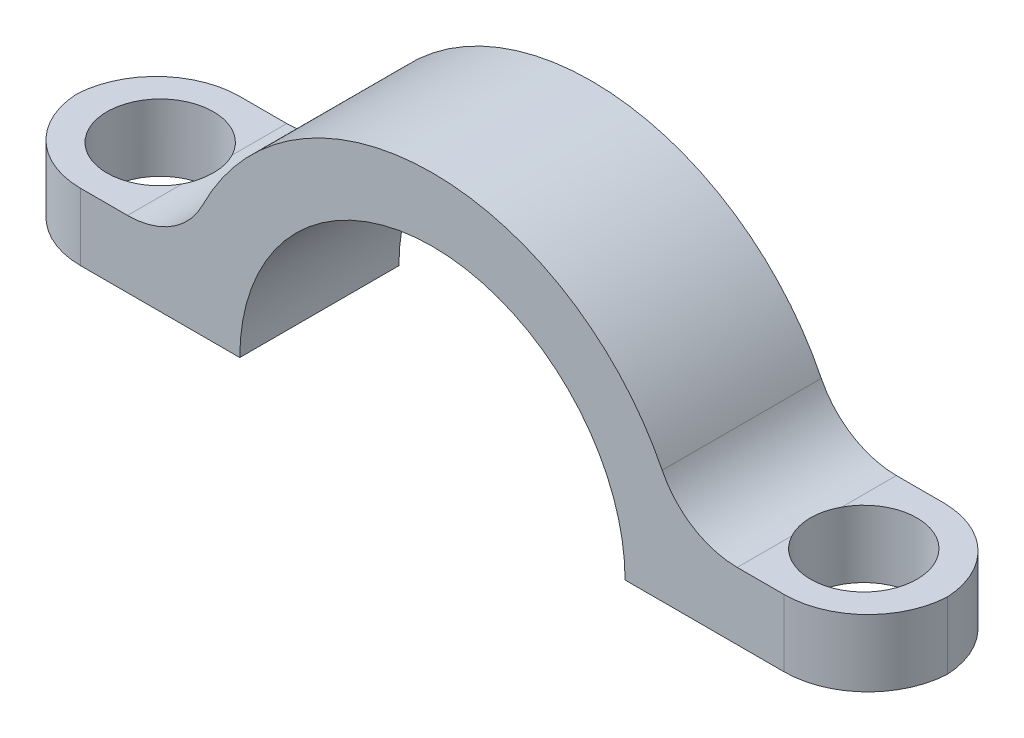
ISO-10303-21;
HEADER;
FILE_DESCRIPTION(('STEP AP214'),'2;1');
FILE_NAME('part.step','',(''),(''),'','','');
FILE_SCHEMA(('AUTOMOTIVE_DESIGN { 1 0 10303 214 1 1 1 1 }'));
ENDSEC;
DATA;
#1=APPLICATION_CONTEXT('core data for automotive mechanical design processes');
#2=APPLICATION_PROTOCOL_DEFINITION('international standard','automotive_design',2000,#1);
#3=PRODUCT_CONTEXT('',#1,'mechanical');
#4=PRODUCT('Part','Part','',(#3));
#5=PRODUCT_RELATED_PRODUCT_CATEGORY('part','',(#4));
#6=PRODUCT_DEFINITION_FORMATION('','',#4);
#7=PRODUCT_DEFINITION_CONTEXT('part definition',#1,'design');
#8=PRODUCT_DEFINITION('design','',#6,#7);
#9=PRODUCT_DEFINITION_SHAPE('','',#8);
#10=(LENGTH_UNIT() NAMED_UNIT(*) SI_UNIT(.MILLI.,.METRE.));
#11=(NAMED_UNIT(*) PLANE_ANGLE_UNIT() SI_UNIT($,.RADIAN.));
#12=(NAMED_UNIT(*) SI_UNIT($,.STERADIAN.) SOLID_ANGLE_UNIT());
#13=UNCERTAINTY_MEASURE_WITH_UNIT(LENGTH_MEASURE(1.E-05),#10,'distance_accuracy_value','');
#14=(GEOMETRIC_REPRESENTATION_CONTEXT(3) GLOBAL_UNCERTAINTY_ASSIGNED_CONTEXT((#13)) GLOBAL_UNIT_ASSIGNED_CONTEXT((#10,
#11,#12)) REPRESENTATION_CONTEXT('',''));
#15=CARTESIAN_POINT('',(0.,0.,0.));
#16=DIRECTION('',(0.,0.,1.));
#17=DIRECTION('',(1.,0.,0.));
#18=AXIS2_PLACEMENT_3D('',#15,#16,#17);
#19=CARTESIAN_POINT('',(0.,0.,9.5));
#20=DIRECTION('',(0.,0.,-1.));
#21=DIRECTION('',(-1.,0.,0.));
#22=AXIS2_PLACEMENT_3D('',#19,#20,#21);
#23=CYLINDRICAL_SURFACE('',#22,11.5);
#24=CARTESIAN_POINT('',(0.,0.,0.));
#25=DIRECTION('',(0.,0.,-1.));
#26=DIRECTION('',(1.,0.,0.));
#27=AXIS2_PLACEMENT_3D('',#24,#25,#26);
#28=CIRCLE('',#27,11.5);
#29=CARTESIAN_POINT('',(-11.5,0.,0.));
#30=VERTEX_POINT('',#29);
#31=CARTESIAN_POINT('',(11.5,0.,0.));
#32=VERTEX_POINT('',#31);
#33=EDGE_CURVE('E268',#30,#32,#28,.T.);
#34=ORIENTED_EDGE('',*,*,#33,.T.);
#35=DIRECTION('',(0.,0.,-1.));
#36=VECTOR('',#35,1.);
#37=CARTESIAN_POINT('',(11.5,0.,9.5));
#38=LINE('',#37,#36);
#39=CARTESIAN_POINT('',(11.5,0.,9.5));
#40=VERTEX_POINT('',#39);
#41=EDGE_CURVE('E248',#40,#32,#38,.T.);
#42=ORIENTED_EDGE('',*,*,#41,.F.);
#43=CARTESIAN_POINT('',(0.,0.,9.5));
#44=DIRECTION('',(0.,0.,-1.));
#45=DIRECTION('',(1.,0.,0.));
#46=AXIS2_PLACEMENT_3D('',#43,#44,#45);
#47=CIRCLE('',#46,11.5);
#48=CARTESIAN_POINT('',(-11.5,0.,9.5));
#49=VERTEX_POINT('',#48);
#50=EDGE_CURVE('E259',#49,#40,#47,.T.);
#51=ORIENTED_EDGE('',*,*,#50,.F.);
#52=DIRECTION('',(0.,0.,-1.));
#53=VECTOR('',#52,1.);
#54=CARTESIAN_POINT('',(-11.5,0.,9.5));
#55=LINE('',#54,#53);
#56=EDGE_CURVE('E253',#49,#30,#55,.T.);
#57=ORIENTED_EDGE('',*,*,#56,.T.);
#58=EDGE_LOOP('',(#34,#42,#51,#57));
#59=FACE_BOUND('',#58,.T.);
#60=ADVANCED_FACE('F37',(#59),#23,.F.);
#61=CARTESIAN_POINT('',(11.5,0.,9.5));
#62=DIRECTION('',(0.,1.,0.));
#63=DIRECTION('',(-1.,0.,0.));
#64=AXIS2_PLACEMENT_3D('',#61,#62,#63);
#65=PLANE('',#64);
#66=CARTESIAN_POINT('',(21.,0.,4.75));
#67=DIRECTION('',(0.,1.,0.));
#68=DIRECTION('',(0.,0.,1.));
#69=AXIS2_PLACEMENT_3D('',#66,#67,#68);
#70=CIRCLE('',#69,3.175);
#71=CARTESIAN_POINT('',(21.,0.,7.925));
#72=VERTEX_POINT('',#71);
#73=EDGE_CURVE('E285',#72,#72,#70,.T.);
#74=ORIENTED_EDGE('',*,*,#73,.T.);
#75=EDGE_LOOP('',(#74));
#76=FACE_BOUND('',#75,.T.);
#77=DIRECTION('',(1.,0.,0.));
#78=VECTOR('',#77,1.);
#79=CARTESIAN_POINT('',(11.5,0.,0.));
#80=LINE('',#79,#78);
#81=CARTESIAN_POINT('',(21.,0.,0.));
#82=VERTEX_POINT('',#81);
#83=EDGE_CURVE('E266',#32,#82,#80,.T.);
#84=ORIENTED_EDGE('',*,*,#83,.T.);
#85=CARTESIAN_POINT('',(21.,0.,5.));
#86=DIRECTION('',(0.,1.,0.));
#87=DIRECTION('',(-1.,0.,0.));
#88=AXIS2_PLACEMENT_3D('',#85,#86,#87);
#89=CIRCLE('',#88,5.);
#90=CARTESIAN_POINT('',(25.9937460888595,0.,4.75));
#91=VERTEX_POINT('',#90);
#92=EDGE_CURVE('E54',#82,#91,#89,.F.);
#93=ORIENTED_EDGE('',*,*,#92,.T.);
#94=CARTESIAN_POINT('',(21.,0.,4.5));
#95=DIRECTION('',(0.,1.,0.));
#96=DIRECTION('',(-1.,0.,0.));
#97=AXIS2_PLACEMENT_3D('',#94,#95,#96);
#98=CIRCLE('',#97,5.);
#99=CARTESIAN_POINT('',(21.,0.,9.5));
#100=VERTEX_POINT('',#99);
#101=EDGE_CURVE('E58',#91,#100,#98,.F.);
#102=ORIENTED_EDGE('',*,*,#101,.T.);
#103=DIRECTION('',(1.,0.,0.));
#104=VECTOR('',#103,1.);
#105=CARTESIAN_POINT('',(11.5,0.,9.5));
#106=LINE('',#105,#104);
#107=EDGE_CURVE('E280',#40,#100,#106,.T.);
#108=ORIENTED_EDGE('',*,*,#107,.F.);
#109=ORIENTED_EDGE('',*,*,#41,.T.);
#110=EDGE_LOOP('',(#84,#93,#102,#108,#109));
#111=FACE_BOUND('',#110,.T.);
#112=ADVANCED_FACE('F221',(#76,#111),#65,.F.);
#113=CARTESIAN_POINT('',(26.,4.,9.5));
#114=DIRECTION('',(0.,-1.,0.));
#115=DIRECTION('',(0.,0.,-1.));
#116=AXIS2_PLACEMENT_3D('',#113,#114,#115);
#117=PLANE('',#116);
#118=CARTESIAN_POINT('',(21.,4.,4.5));
#119=DIRECTION('',(0.,-1.,0.));
#120=DIRECTION('',(0.,0.,-1.));
#121=AXIS2_PLACEMENT_3D('',#118,#119,#120);
#122=CIRCLE('',#121,5.);
#123=CARTESIAN_POINT('',(21.,4.,9.5));
#124=VERTEX_POINT('',#123);
#125=CARTESIAN_POINT('',(25.9937460888595,4.,4.75));
#126=VERTEX_POINT('',#125);
#127=EDGE_CURVE('E319',#124,#126,#122,.F.);
#128=ORIENTED_EDGE('',*,*,#127,.T.);
#129=CARTESIAN_POINT('',(21.,4.,5.));
#130=DIRECTION('',(0.,-1.,0.));
#131=DIRECTION('',(0.,0.,-1.));
#132=AXIS2_PLACEMENT_3D('',#129,#130,#131);
#133=CIRCLE('',#132,5.);
#134=CARTESIAN_POINT('',(21.,4.,0.));
#135=VERTEX_POINT('',#134);
#136=EDGE_CURVE('E321',#126,#135,#133,.F.);
#137=ORIENTED_EDGE('',*,*,#136,.T.);
#138=DIRECTION('',(-1.,0.,0.));
#139=VECTOR('',#138,1.);
#140=CARTESIAN_POINT('',(26.,4.,0.));
#141=LINE('',#140,#139);
#142=CARTESIAN_POINT('',(18.1958786542448,4.,0.));
#143=VERTEX_POINT('',#142);
#144=EDGE_CURVE('E264',#135,#143,#141,.T.);
#145=ORIENTED_EDGE('',*,*,#144,.T.);
#146=DIRECTION('',(0.,0.,1.));
#147=VECTOR('',#146,1.);
#148=CARTESIAN_POINT('',(18.1958786542448,4.,9.5));
#149=LINE('',#148,#147);
#150=CARTESIAN_POINT('',(18.1958786542448,4.,3.26086317677662));
#151=VERTEX_POINT('',#150);
#152=EDGE_CURVE('E161',#143,#151,#149,.T.);
#153=ORIENTED_EDGE('',*,*,#152,.T.);
#154=CARTESIAN_POINT('',(21.,4.,4.75));
#155=DIRECTION('',(0.,-1.,0.));
#156=DIRECTION('',(0.,0.,-1.));
#157=AXIS2_PLACEMENT_3D('',#154,#155,#156);
#158=CIRCLE('',#157,3.175);
#159=CARTESIAN_POINT('',(18.1958786542448,4.,6.23913682322338));
#160=VERTEX_POINT('',#159);
#161=EDGE_CURVE('E154',#151,#160,#158,.T.);
#162=ORIENTED_EDGE('',*,*,#161,.T.);
#163=CARTESIAN_POINT('',(18.1958786542448,4.,9.5));
#164=VERTEX_POINT('',#163);
#165=EDGE_CURVE('E165',#160,#164,#149,.T.);
#166=ORIENTED_EDGE('',*,*,#165,.T.);
#167=DIRECTION('',(-1.,0.,0.));
#168=VECTOR('',#167,1.);
#169=CARTESIAN_POINT('',(26.,4.,9.5));
#170=LINE('',#169,#168);
#171=EDGE_CURVE('E278',#124,#164,#170,.T.);
#172=ORIENTED_EDGE('',*,*,#171,.F.);
#173=EDGE_LOOP('',(#128,#137,#145,#153,#162,#166,#172));
#174=FACE_BOUND('',#173,.T.);
#175=ADVANCED_FACE('F217',(#174),#117,.F.);
#176=CARTESIAN_POINT('',(0.,0.,9.5));
#177=DIRECTION('',(0.,0.,-1.));
#178=DIRECTION('',(-1.,0.,0.));
#179=AXIS2_PLACEMENT_3D('',#176,#177,#178);
#180=CYLINDRICAL_SURFACE('',#179,15.3);
#181=CARTESIAN_POINT('',(0.,0.,9.5));
#182=DIRECTION('',(0.,0.,1.));
#183=DIRECTION('',(1.,0.,0.));
#184=AXIS2_PLACEMENT_3D('',#181,#182,#183);
#185=CIRCLE('',#184,15.3);
#186=CARTESIAN_POINT('',(13.714135143347,6.78325123152709,9.5));
#187=VERTEX_POINT('',#186);
#188=CARTESIAN_POINT('',(-13.714135143347,6.78325123152709,9.5));
#189=VERTEX_POINT('',#188);
#190=EDGE_CURVE('E275',#187,#189,#185,.T.);
#191=ORIENTED_EDGE('',*,*,#190,.F.);
#192=DIRECTION('',(0.,0.,-1.));
#193=VECTOR('',#192,1.);
#194=CARTESIAN_POINT('',(13.714135143347,6.78325123152709,9.5));
#195=LINE('',#194,#193);
#196=CARTESIAN_POINT('',(13.714135143347,6.78325123152709,0.));
#197=VERTEX_POINT('',#196);
#198=EDGE_CURVE('E242',#187,#197,#195,.T.);
#199=ORIENTED_EDGE('',*,*,#198,.T.);
#200=CARTESIAN_POINT('',(0.,0.,0.));
#201=DIRECTION('',(0.,0.,1.));
#202=DIRECTION('',(1.,0.,0.));
#203=AXIS2_PLACEMENT_3D('',#200,#201,#202);
#204=CIRCLE('',#203,15.3);
#205=CARTESIAN_POINT('',(-13.714135143347,6.78325123152709,0.));
#206=VERTEX_POINT('',#205);
#207=EDGE_CURVE('E262',#197,#206,#204,.T.);
#208=ORIENTED_EDGE('',*,*,#207,.T.);
#209=DIRECTION('',(0.,0.,-1.));
#210=VECTOR('',#209,1.);
#211=CARTESIAN_POINT('',(-13.714135143347,6.78325123152709,9.5));
#212=LINE('',#211,#210);
#213=EDGE_CURVE('E244',#206,#189,#212,.F.);
#214=ORIENTED_EDGE('',*,*,#213,.T.);
#215=EDGE_LOOP('',(#191,#199,#208,#214));
#216=FACE_BOUND('',#215,.T.);
#217=ADVANCED_FACE('F214',(#216),#180,.T.);
#218=CARTESIAN_POINT('',(-26.,4.,9.5));
#219=DIRECTION('',(0.,-1.,0.));
#220=DIRECTION('',(0.,0.,-1.));
#221=AXIS2_PLACEMENT_3D('',#218,#219,#220);
#222=PLANE('',#221);
#223=DIRECTION('',(-1.,0.,0.));
#224=VECTOR('',#223,1.);
#225=CARTESIAN_POINT('',(-26.,4.,0.));
#226=LINE('',#225,#224);
#227=CARTESIAN_POINT('',(-18.1958786542448,4.,0.));
#228=VERTEX_POINT('',#227);
#229=CARTESIAN_POINT('',(-21.,4.,0.));
#230=VERTEX_POINT('',#229);
#231=EDGE_CURVE('E260',#228,#230,#226,.T.);
#232=ORIENTED_EDGE('',*,*,#231,.T.);
#233=CARTESIAN_POINT('',(-21.,4.,5.));
#234=DIRECTION('',(0.,-1.,0.));
#235=DIRECTION('',(0.,0.,-1.));
#236=AXIS2_PLACEMENT_3D('',#233,#234,#235);
#237=CIRCLE('',#236,5.);
#238=CARTESIAN_POINT('',(-25.9937460888595,4.,4.75));
#239=VERTEX_POINT('',#238);
#240=EDGE_CURVE('E317',#230,#239,#237,.F.);
#241=ORIENTED_EDGE('',*,*,#240,.T.);
#242=CARTESIAN_POINT('',(-21.,4.,4.5));
#243=DIRECTION('',(0.,-1.,0.));
#244=DIRECTION('',(0.,0.,-1.));
#245=AXIS2_PLACEMENT_3D('',#242,#243,#244);
#246=CIRCLE('',#245,5.);
#247=CARTESIAN_POINT('',(-21.,4.,9.5));
#248=VERTEX_POINT('',#247);
#249=EDGE_CURVE('E304',#239,#248,#246,.F.);
#250=ORIENTED_EDGE('',*,*,#249,.T.);
#251=DIRECTION('',(-1.,0.,0.));
#252=VECTOR('',#251,1.);
#253=CARTESIAN_POINT('',(-26.,4.,9.5));
#254=LINE('',#253,#252);
#255=CARTESIAN_POINT('',(-18.1958786542448,4.,9.5));
#256=VERTEX_POINT('',#255);
#257=EDGE_CURVE('E272',#256,#248,#254,.T.);
#258=ORIENTED_EDGE('',*,*,#257,.F.);
#259=DIRECTION('',(0.,0.,1.));
#260=VECTOR('',#259,1.);
#261=CARTESIAN_POINT('',(-18.1958786542448,4.,0.));
#262=LINE('',#261,#260);
#263=CARTESIAN_POINT('',(-18.1958786542448,4.,6.23913682322339));
#264=VERTEX_POINT('',#263);
#265=EDGE_CURVE('E153',#256,#264,#262,.F.);
#266=ORIENTED_EDGE('',*,*,#265,.T.);
#267=CARTESIAN_POINT('',(-21.,4.,4.75));
#268=DIRECTION('',(0.,-1.,0.));
#269=DIRECTION('',(0.,0.,-1.));
#270=AXIS2_PLACEMENT_3D('',#267,#268,#269);
#271=CIRCLE('',#270,3.175);
#272=CARTESIAN_POINT('',(-18.1958786542448,4.,3.26086317677661));
#273=VERTEX_POINT('',#272);
#274=EDGE_CURVE('E139',#264,#273,#271,.T.);
#275=ORIENTED_EDGE('',*,*,#274,.T.);
#276=EDGE_CURVE('E150',#273,#228,#262,.F.);
#277=ORIENTED_EDGE('',*,*,#276,.T.);
#278=EDGE_LOOP('',(#232,#241,#250,#258,#266,#275,#277));
#279=FACE_BOUND('',#278,.T.);
#280=ADVANCED_FACE('F149',(#279),#222,.F.);
#281=CARTESIAN_POINT('',(-11.5,0.,9.5));
#282=DIRECTION('',(0.,1.,0.));
#283=DIRECTION('',(-1.,0.,0.));
#284=AXIS2_PLACEMENT_3D('',#281,#282,#283);
#285=PLANE('',#284);
#286=CARTESIAN_POINT('',(-21.,0.,4.75));
#287=DIRECTION('',(0.,1.,0.));
#288=DIRECTION('',(0.,0.,1.));
#289=AXIS2_PLACEMENT_3D('',#286,#287,#288);
#290=CIRCLE('',#289,3.175);
#291=CARTESIAN_POINT('',(-21.,0.,7.925));
#292=VERTEX_POINT('',#291);
#293=EDGE_CURVE('E155',#292,#292,#290,.T.);
#294=ORIENTED_EDGE('',*,*,#293,.T.);
#295=EDGE_LOOP('',(#294));
#296=FACE_BOUND('',#295,.T.);
#297=CARTESIAN_POINT('',(-21.,0.,4.5));
#298=DIRECTION('',(0.,1.,0.));
#299=DIRECTION('',(-1.,0.,0.));
#300=AXIS2_PLACEMENT_3D('',#297,#298,#299);
#301=CIRCLE('',#300,5.);
#302=CARTESIAN_POINT('',(-21.,0.,9.5));
#303=VERTEX_POINT('',#302);
#304=CARTESIAN_POINT('',(-25.9937460888595,0.,4.75));
#305=VERTEX_POINT('',#304);
#306=EDGE_CURVE('E294',#303,#305,#301,.F.);
#307=ORIENTED_EDGE('',*,*,#306,.T.);
#308=CARTESIAN_POINT('',(-21.,0.,5.));
#309=DIRECTION('',(0.,1.,0.));
#310=DIRECTION('',(-1.,0.,0.));
#311=AXIS2_PLACEMENT_3D('',#308,#309,#310);
#312=CIRCLE('',#311,5.);
#313=CARTESIAN_POINT('',(-21.,0.,0.));
#314=VERTEX_POINT('',#313);
#315=EDGE_CURVE('E297',#305,#314,#312,.F.);
#316=ORIENTED_EDGE('',*,*,#315,.T.);
#317=DIRECTION('',(1.,0.,0.));
#318=VECTOR('',#317,1.);
#319=CARTESIAN_POINT('',(-11.5,0.,0.));
#320=LINE('',#319,#318);
#321=EDGE_CURVE('E257',#314,#30,#320,.T.);
#322=ORIENTED_EDGE('',*,*,#321,.T.);
#323=ORIENTED_EDGE('',*,*,#56,.F.);
#324=DIRECTION('',(1.,0.,0.));
#325=VECTOR('',#324,1.);
#326=CARTESIAN_POINT('',(-11.5,0.,9.5));
#327=LINE('',#326,#325);
#328=EDGE_CURVE('E256',#303,#49,#327,.T.);
#329=ORIENTED_EDGE('',*,*,#328,.F.);
#330=EDGE_LOOP('',(#307,#316,#322,#323,#329));
#331=FACE_BOUND('',#330,.T.);
#332=ADVANCED_FACE('F203',(#296,#331),#285,.F.);
#333=CARTESIAN_POINT('',(0.,0.,9.5));
#334=DIRECTION('',(0.,0.,1.));
#335=DIRECTION('',(1.,0.,0.));
#336=AXIS2_PLACEMENT_3D('',#333,#334,#335);
#337=PLANE('',#336);
#338=ORIENTED_EDGE('',*,*,#107,.T.);
#339=DIRECTION('',(0.,1.,0.));
#340=VECTOR('',#339,1.);
#341=CARTESIAN_POINT('',(21.,4.,9.5));
#342=LINE('',#341,#340);
#343=EDGE_CURVE('E11',#100,#124,#342,.T.);
#344=ORIENTED_EDGE('',*,*,#343,.T.);
#345=ORIENTED_EDGE('',*,*,#171,.T.);
#346=CARTESIAN_POINT('',(18.1958786542448,9.,9.5));
#347=DIRECTION('',(0.,0.,1.));
#348=DIRECTION('',(1.,0.,0.));
#349=AXIS2_PLACEMENT_3D('',#346,#347,#348);
#350=CIRCLE('',#349,5.);
#351=EDGE_CURVE('E171',#164,#187,#350,.F.);
#352=ORIENTED_EDGE('',*,*,#351,.T.);
#353=ORIENTED_EDGE('',*,*,#190,.T.);
#354=CARTESIAN_POINT('',(-18.1958786542448,9.,9.5));
#355=DIRECTION('',(0.,0.,1.));
#356=DIRECTION('',(1.,0.,0.));
#357=AXIS2_PLACEMENT_3D('',#354,#355,#356);
#358=CIRCLE('',#357,5.);
#359=EDGE_CURVE('E145',#189,#256,#358,.F.);
#360=ORIENTED_EDGE('',*,*,#359,.T.);
#361=ORIENTED_EDGE('',*,*,#257,.T.);
#362=DIRECTION('',(0.,-1.,0.));
#363=VECTOR('',#362,1.);
#364=CARTESIAN_POINT('',(-21.,0.,9.5));
#365=LINE('',#364,#363);
#366=EDGE_CURVE('E46',#248,#303,#365,.T.);
#367=ORIENTED_EDGE('',*,*,#366,.T.);
#368=ORIENTED_EDGE('',*,*,#328,.T.);
#369=ORIENTED_EDGE('',*,*,#50,.T.);
#370=EDGE_LOOP('',(#338,#344,#345,#352,#353,#360,#361,#367,#368,#369));
#371=FACE_BOUND('',#370,.T.);
#372=ADVANCED_FACE('F199',(#371),#337,.T.);
#373=CARTESIAN_POINT('',(0.,0.,0.));
#374=DIRECTION('',(0.,0.,1.));
#375=DIRECTION('',(1.,0.,0.));
#376=AXIS2_PLACEMENT_3D('',#373,#374,#375);
#377=PLANE('',#376);
#378=ORIENTED_EDGE('',*,*,#321,.F.);
#379=DIRECTION('',(0.,-1.,0.));
#380=VECTOR('',#379,1.);
#381=CARTESIAN_POINT('',(-21.,0.,0.));
#382=LINE('',#381,#380);
#383=EDGE_CURVE('E309',#314,#230,#382,.F.);
#384=ORIENTED_EDGE('',*,*,#383,.T.);
#385=ORIENTED_EDGE('',*,*,#231,.F.);
#386=CARTESIAN_POINT('',(-18.1958786542448,9.,0.));
#387=DIRECTION('',(0.,0.,1.));
#388=DIRECTION('',(1.,0.,0.));
#389=AXIS2_PLACEMENT_3D('',#386,#387,#388);
#390=CIRCLE('',#389,5.);
#391=EDGE_CURVE('E159',#228,#206,#390,.T.);
#392=ORIENTED_EDGE('',*,*,#391,.T.);
#393=ORIENTED_EDGE('',*,*,#207,.F.);
#394=CARTESIAN_POINT('',(18.1958786542448,9.,0.));
#395=DIRECTION('',(0.,0.,1.));
#396=DIRECTION('',(1.,0.,0.));
#397=AXIS2_PLACEMENT_3D('',#394,#395,#396);
#398=CIRCLE('',#397,5.);
#399=EDGE_CURVE('E163',#197,#143,#398,.T.);
#400=ORIENTED_EDGE('',*,*,#399,.T.);
#401=ORIENTED_EDGE('',*,*,#144,.F.);
#402=DIRECTION('',(0.,1.,0.));
#403=VECTOR('',#402,1.);
#404=CARTESIAN_POINT('',(21.,0.,0.));
#405=LINE('',#404,#403);
#406=EDGE_CURVE('E310',#135,#82,#405,.F.);
#407=ORIENTED_EDGE('',*,*,#406,.T.);
#408=ORIENTED_EDGE('',*,*,#83,.F.);
#409=ORIENTED_EDGE('',*,*,#33,.F.);
#410=EDGE_LOOP('',(#378,#384,#385,#392,#393,#400,#401,#407,#408,#409));
#411=FACE_BOUND('',#410,.T.);
#412=ADVANCED_FACE('F202',(#411),#377,.F.);
#413=CARTESIAN_POINT('',(18.1958786542448,9.,9.5));
#414=DIRECTION('',(0.,0.,-1.));
#415=DIRECTION('',(-1.,0.,0.));
#416=AXIS2_PLACEMENT_3D('',#413,#414,#415);
#417=CYLINDRICAL_SURFACE('',#416,5.);
#418=ORIENTED_EDGE('',*,*,#165,.F.);
#419=CARTESIAN_POINT('',(18.1958786542448,4.,6.23913682322338));
#420=CARTESIAN_POINT('',(18.1539979476198,4.00001147946186,6.16029156971243));
#421=CARTESIAN_POINT('',(18.1154614955096,4.00052666383196,6.07967865545317));
#422=CARTESIAN_POINT('',(18.0453127127969,4.00214135114437,5.91550513643708));
#423=CARTESIAN_POINT('',(18.013699965699,4.00324081892547,5.83194470933921));
#424=CARTESIAN_POINT('',(17.9576657181,4.00559954399005,5.66256482781802));
#425=CARTESIAN_POINT('',(17.9332348811282,4.00685859074466,5.57674846572808));
#426=CARTESIAN_POINT('',(17.8916780247956,4.00921996392662,5.40338645388867));
#427=CARTESIAN_POINT('',(17.8745518827946,4.01032229298493,5.31584083319795));
#428=CARTESIAN_POINT('',(17.834318126288,4.01300802787872,5.05138558363555));
#429=CARTESIAN_POINT('',(17.8223517246599,4.01397039217124,4.87264708609901));
#430=CARTESIAN_POINT('',(17.8286292561209,4.01350483051492,4.5157397572401));
#431=CARTESIAN_POINT('',(17.8468657306821,4.01207749469585,4.33757079615777));
#432=CARTESIAN_POINT('',(17.8946377484826,4.00906484455122,4.08384739875444));
#433=CARTESIAN_POINT('',(17.9123874026605,4.00800121226595,4.0059148305011));
#434=CARTESIAN_POINT('',(17.9537123580366,4.00582413766147,3.8515968573053));
#435=CARTESIAN_POINT('',(17.9772871796282,4.00471069944913,3.77521132554981));
#436=CARTESIAN_POINT('',(18.0301481422886,4.00267719894945,3.62439143057265));
#437=CARTESIAN_POINT('',(18.0594378249503,4.00175725731352,3.54995830990824));
#438=CARTESIAN_POINT('',(18.1235509843115,4.00042219450671,3.40349877681184));
#439=CARTESIAN_POINT('',(18.1583751958776,4.00000714043748,3.33147268552085));
#440=CARTESIAN_POINT('',(18.1958786542448,4.,3.26086317677662));
#441=B_SPLINE_CURVE_WITH_KNOTS('',3,(#419,#420,#421,#422,#423,#424,#425,#426,#427,#428,#429,
#430,#431,#432,#433,#434,#435,#436,#437,#438,#439,#440),.UNSPECIFIED.,.F.,.F.,(4,2,2,2,2,2,2,2,
2,2,4),(0.,0.267741417285312,0.535466724156736,0.802842433651225,1.07021365393546,
1.6049234011075,2.13950112267405,2.3791267210745,2.61873259682987,2.85848743461483,
3.09827413332856),.UNSPECIFIED.);
#442=EDGE_CURVE('E144',#160,#151,#441,.T.);
#443=ORIENTED_EDGE('',*,*,#442,.T.);
#444=ORIENTED_EDGE('',*,*,#152,.F.);
#445=ORIENTED_EDGE('',*,*,#399,.F.);
#446=ORIENTED_EDGE('',*,*,#198,.F.);
#447=ORIENTED_EDGE('',*,*,#351,.F.);
#448=EDGE_LOOP('',(#418,#443,#444,#445,#446,#447));
#449=FACE_BOUND('',#448,.T.);
#450=ADVANCED_FACE('F207',(#449),#417,.F.);
#451=CARTESIAN_POINT('',(-18.1958786542448,9.,9.5));
#452=DIRECTION('',(0.,0.,-1.));
#453=DIRECTION('',(-1.,0.,0.));
#454=AXIS2_PLACEMENT_3D('',#451,#452,#453);
#455=CYLINDRICAL_SURFACE('',#454,5.);
#456=ORIENTED_EDGE('',*,*,#276,.F.);
#457=CARTESIAN_POINT('',(-18.1958786542448,4.,3.26086317677661));
#458=CARTESIAN_POINT('',(-18.1539979476198,4.00001147946186,3.33970843028756));
#459=CARTESIAN_POINT('',(-18.1154614955096,4.00052666383196,3.42032134454682));
#460=CARTESIAN_POINT('',(-18.0453127127969,4.00214135114437,3.5844948635629));
#461=CARTESIAN_POINT('',(-18.013699965699,4.00324081892547,3.66805529066078));
#462=CARTESIAN_POINT('',(-17.9576657181,4.00559954399005,3.83743517218196));
#463=CARTESIAN_POINT('',(-17.9332348811282,4.00685859074466,3.92325153427191));
#464=CARTESIAN_POINT('',(-17.8916780247956,4.00921996392662,4.09661354611132));
#465=CARTESIAN_POINT('',(-17.8745518827946,4.01032229298493,4.18415916680204));
#466=CARTESIAN_POINT('',(-17.834318126288,4.01300802787872,4.44861441636444));
#467=CARTESIAN_POINT('',(-17.8223517246599,4.01397039217124,4.62735291390097));
#468=CARTESIAN_POINT('',(-17.8286292561209,4.01350483051492,4.98426024275989));
#469=CARTESIAN_POINT('',(-17.8468657306821,4.01207749469585,5.16242920384222));
#470=CARTESIAN_POINT('',(-17.8946377484826,4.00906484455122,5.41615260124555));
#471=CARTESIAN_POINT('',(-17.9123874026605,4.00800121226596,5.49408516949889));
#472=CARTESIAN_POINT('',(-17.9537123580366,4.00582413766147,5.6484031426947));
#473=CARTESIAN_POINT('',(-17.9772871796282,4.00471069944913,5.72478867445019));
#474=CARTESIAN_POINT('',(-18.0301481422886,4.00267719894945,5.87560856942735));
#475=CARTESIAN_POINT('',(-18.0594378249503,4.00175725731352,5.95004169009176));
#476=CARTESIAN_POINT('',(-18.1235509843115,4.00042219450671,6.09650122318816));
#477=CARTESIAN_POINT('',(-18.1583751958776,4.00000714043748,6.16852731447916));
#478=CARTESIAN_POINT('',(-18.1958786542448,4.,6.23913682322339));
#479=B_SPLINE_CURVE_WITH_KNOTS('',3,(#457,#458,#459,#460,#461,#462,#463,#464,#465,#466,#467,
#468,#469,#470,#471,#472,#473,#474,#475,#476,#477,#478),.UNSPECIFIED.,.F.,.F.,(4,2,2,2,2,2,2,2,
2,2,4),(0.,0.267741417285313,0.535466724156739,0.802842433651227,1.07021365393546,
1.6049234011075,2.13950112267405,2.37912672107451,2.61873259682988,2.85848743461485,
3.09827413332859),.UNSPECIFIED.);
#480=EDGE_CURVE('E136',#273,#264,#479,.T.);
#481=ORIENTED_EDGE('',*,*,#480,.T.);
#482=ORIENTED_EDGE('',*,*,#265,.F.);
#483=ORIENTED_EDGE('',*,*,#359,.F.);
#484=ORIENTED_EDGE('',*,*,#213,.F.);
#485=ORIENTED_EDGE('',*,*,#391,.F.);
#486=EDGE_LOOP('',(#456,#481,#482,#483,#484,#485));
#487=FACE_BOUND('',#486,.T.);
#488=ADVANCED_FACE('F157',(#487),#455,.F.);
#489=CARTESIAN_POINT('',(-21.,0.,4.75));
#490=DIRECTION('',(0.,1.,0.));
#491=DIRECTION('',(0.,0.,1.));
#492=AXIS2_PLACEMENT_3D('',#489,#490,#491);
#493=CYLINDRICAL_SURFACE('',#492,3.175);
#494=ORIENTED_EDGE('',*,*,#293,.F.);
#495=EDGE_LOOP('',(#494));
#496=FACE_BOUND('',#495,.T.);
#497=ORIENTED_EDGE('',*,*,#480,.F.);
#498=ORIENTED_EDGE('',*,*,#274,.F.);
#499=EDGE_LOOP('',(#497,#498));
#500=FACE_BOUND('',#499,.T.);
#501=ADVANCED_FACE('F138',(#496,#500),#493,.F.);
#502=CARTESIAN_POINT('',(21.,0.,4.75));
#503=DIRECTION('',(0.,1.,0.));
#504=DIRECTION('',(0.,0.,1.));
#505=AXIS2_PLACEMENT_3D('',#502,#503,#504);
#506=CYLINDRICAL_SURFACE('',#505,3.175);
#507=ORIENTED_EDGE('',*,*,#73,.F.);
#508=EDGE_LOOP('',(#507));
#509=FACE_BOUND('',#508,.T.);
#510=ORIENTED_EDGE('',*,*,#442,.F.);
#511=ORIENTED_EDGE('',*,*,#161,.F.);
#512=EDGE_LOOP('',(#510,#511));
#513=FACE_BOUND('',#512,.T.);
#514=ADVANCED_FACE('F192',(#509,#513),#506,.F.);
#515=CARTESIAN_POINT('',(-21.,0.,4.5));
#516=DIRECTION('',(0.,1.,0.));
#517=DIRECTION('',(0.,0.,1.));
#518=AXIS2_PLACEMENT_3D('',#515,#516,#517);
#519=CYLINDRICAL_SURFACE('',#518,5.);
#520=ORIENTED_EDGE('',*,*,#366,.F.);
#521=ORIENTED_EDGE('',*,*,#249,.F.);
#522=DIRECTION('',(0.,1.,0.));
#523=VECTOR('',#522,1.);
#524=CARTESIAN_POINT('',(-25.9937460888595,2.,4.75));
#525=LINE('',#524,#523);
#526=EDGE_CURVE('E288',#305,#239,#525,.T.);
#527=ORIENTED_EDGE('',*,*,#526,.F.);
#528=ORIENTED_EDGE('',*,*,#306,.F.);
#529=EDGE_LOOP('',(#520,#521,#527,#528));
#530=FACE_BOUND('',#529,.T.);
#531=ADVANCED_FACE('F197',(#530),#519,.T.);
#532=CARTESIAN_POINT('',(-21.,0.,5.));
#533=DIRECTION('',(0.,-1.,0.));
#534=DIRECTION('',(0.,0.,-1.));
#535=AXIS2_PLACEMENT_3D('',#532,#533,#534);
#536=CYLINDRICAL_SURFACE('',#535,5.);
#537=ORIENTED_EDGE('',*,*,#240,.F.);
#538=ORIENTED_EDGE('',*,*,#383,.F.);
#539=ORIENTED_EDGE('',*,*,#315,.F.);
#540=ORIENTED_EDGE('',*,*,#526,.T.);
#541=EDGE_LOOP('',(#537,#538,#539,#540));
#542=FACE_BOUND('',#541,.T.);
#543=ADVANCED_FACE('F307',(#542),#536,.T.);
#544=CARTESIAN_POINT('',(21.,0.,4.5));
#545=DIRECTION('',(0.,-1.,0.));
#546=DIRECTION('',(0.,0.,-1.));
#547=AXIS2_PLACEMENT_3D('',#544,#545,#546);
#548=CYLINDRICAL_SURFACE('',#547,5.);
#549=ORIENTED_EDGE('',*,*,#343,.F.);
#550=ORIENTED_EDGE('',*,*,#101,.F.);
#551=DIRECTION('',(0.,-1.,0.));
#552=VECTOR('',#551,1.);
#553=CARTESIAN_POINT('',(25.9937460888595,2.,4.75));
#554=LINE('',#553,#552);
#555=EDGE_CURVE('E41',#126,#91,#554,.T.);
#556=ORIENTED_EDGE('',*,*,#555,.F.);
#557=ORIENTED_EDGE('',*,*,#127,.F.);
#558=EDGE_LOOP('',(#549,#550,#556,#557));
#559=FACE_BOUND('',#558,.T.);
#560=ADVANCED_FACE('F39',(#559),#548,.T.);
#561=CARTESIAN_POINT('',(21.,0.,5.));
#562=DIRECTION('',(0.,1.,0.));
#563=DIRECTION('',(0.,0.,1.));
#564=AXIS2_PLACEMENT_3D('',#561,#562,#563);
#565=CYLINDRICAL_SURFACE('',#564,5.);
#566=ORIENTED_EDGE('',*,*,#92,.F.);
#567=ORIENTED_EDGE('',*,*,#406,.F.);
#568=ORIENTED_EDGE('',*,*,#136,.F.);
#569=ORIENTED_EDGE('',*,*,#555,.T.);
#570=EDGE_LOOP('',(#566,#567,#568,#569));
#571=FACE_BOUND('',#570,.T.);
#572=ADVANCED_FACE('F334',(#571),#565,.T.);
#573=CLOSED_SHELL('',(#60,#112,#175,#217,#280,#332,#372,#412,#450,#488,#501,#514,#531,#543,#560,#572));
#574=MANIFOLD_SOLID_BREP('B2',#573);
#575=ADVANCED_BREP_SHAPE_REPRESENTATION('',(#18,#574),#14);
#576=SHAPE_DEFINITION_REPRESENTATION(#9,#575);
ENDSEC;
END-ISO-10303-21;
